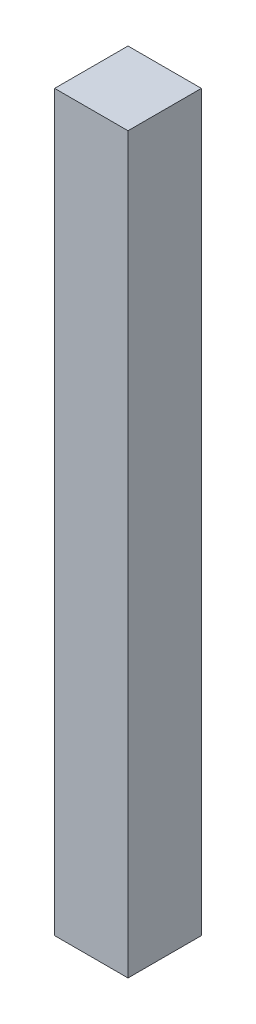
ISO-10303-21;
HEADER;
FILE_DESCRIPTION(('STEP AP214'),'2;1');
FILE_NAME('part.step','',(''),(''),'','','');
FILE_SCHEMA(('AUTOMOTIVE_DESIGN { 1 0 10303 214 1 1 1 1 }'));
ENDSEC;
DATA;
#1=APPLICATION_CONTEXT('core data for automotive mechanical design processes');
#2=APPLICATION_PROTOCOL_DEFINITION('international standard','automotive_design',2000,#1);
#3=PRODUCT_CONTEXT('',#1,'mechanical');
#4=PRODUCT('Part','Part','',(#3));
#5=PRODUCT_RELATED_PRODUCT_CATEGORY('part','',(#4));
#6=PRODUCT_DEFINITION_FORMATION('','',#4);
#7=PRODUCT_DEFINITION_CONTEXT('part definition',#1,'design');
#8=PRODUCT_DEFINITION('design','',#6,#7);
#9=PRODUCT_DEFINITION_SHAPE('','',#8);
#10=(LENGTH_UNIT() NAMED_UNIT(*) SI_UNIT(.MILLI.,.METRE.));
#11=(NAMED_UNIT(*) PLANE_ANGLE_UNIT() SI_UNIT($,.RADIAN.));
#12=(NAMED_UNIT(*) SI_UNIT($,.STERADIAN.) SOLID_ANGLE_UNIT());
#13=UNCERTAINTY_MEASURE_WITH_UNIT(LENGTH_MEASURE(1.E-05),#10,'distance_accuracy_value','');
#14=(GEOMETRIC_REPRESENTATION_CONTEXT(3) GLOBAL_UNCERTAINTY_ASSIGNED_CONTEXT((#13)) GLOBAL_UNIT_ASSIGNED_CONTEXT((#10,
#11,#12)) REPRESENTATION_CONTEXT('',''));
#15=CARTESIAN_POINT('',(0.,0.,0.));
#16=DIRECTION('',(0.,0.,1.));
#17=DIRECTION('',(1.,0.,0.));
#18=AXIS2_PLACEMENT_3D('',#15,#16,#17);
#19=CARTESIAN_POINT('',(0.,0.,5.));
#20=DIRECTION('',(-1.,0.,0.));
#21=DIRECTION('',(0.,-1.,0.));
#22=AXIS2_PLACEMENT_3D('',#19,#20,#21);
#23=PLANE('',#22);
#24=DIRECTION('',(0.,1.,0.));
#25=VECTOR('',#24,1.);
#26=CARTESIAN_POINT('',(0.,0.,0.));
#27=LINE('',#26,#25);
#28=CARTESIAN_POINT('',(0.,-50.,0.));
#29=VERTEX_POINT('',#28);
#30=CARTESIAN_POINT('',(0.,0.,0.));
#31=VERTEX_POINT('',#30);
#32=EDGE_CURVE('E96',#29,#31,#27,.T.);
#33=ORIENTED_EDGE('',*,*,#32,.T.);
#34=DIRECTION('',(0.,0.,-1.));
#35=VECTOR('',#34,1.);
#36=CARTESIAN_POINT('',(0.,0.,5.));
#37=LINE('',#36,#35);
#38=CARTESIAN_POINT('',(0.,0.,5.));
#39=VERTEX_POINT('',#38);
#40=EDGE_CURVE('E11',#39,#31,#37,.T.);
#41=ORIENTED_EDGE('',*,*,#40,.F.);
#42=DIRECTION('',(0.,1.,0.));
#43=VECTOR('',#42,1.);
#44=CARTESIAN_POINT('',(0.,0.,5.));
#45=LINE('',#44,#43);
#46=CARTESIAN_POINT('',(0.,-50.,5.));
#47=VERTEX_POINT('',#46);
#48=EDGE_CURVE('E84',#47,#39,#45,.T.);
#49=ORIENTED_EDGE('',*,*,#48,.F.);
#50=DIRECTION('',(0.,0.,-1.));
#51=VECTOR('',#50,1.);
#52=CARTESIAN_POINT('',(0.,-50.,5.));
#53=LINE('',#52,#51);
#54=EDGE_CURVE('E92',#47,#29,#53,.T.);
#55=ORIENTED_EDGE('',*,*,#54,.T.);
#56=EDGE_LOOP('',(#33,#41,#49,#55));
#57=FACE_BOUND('',#56,.T.);
#58=ADVANCED_FACE('F33',(#57),#23,.F.);
#59=CARTESIAN_POINT('',(0.,0.,5.));
#60=DIRECTION('',(0.,-1.,0.));
#61=DIRECTION('',(0.,0.,-1.));
#62=AXIS2_PLACEMENT_3D('',#59,#60,#61);
#63=PLANE('',#62);
#64=DIRECTION('',(-1.,0.,0.));
#65=VECTOR('',#64,1.);
#66=CARTESIAN_POINT('',(0.,0.,0.));
#67=LINE('',#66,#65);
#68=CARTESIAN_POINT('',(-5.,0.,0.));
#69=VERTEX_POINT('',#68);
#70=EDGE_CURVE('E88',#31,#69,#67,.T.);
#71=ORIENTED_EDGE('',*,*,#70,.T.);
#72=DIRECTION('',(0.,0.,-1.));
#73=VECTOR('',#72,1.);
#74=CARTESIAN_POINT('',(-5.,0.,5.));
#75=LINE('',#74,#73);
#76=CARTESIAN_POINT('',(-5.,0.,5.));
#77=VERTEX_POINT('',#76);
#78=EDGE_CURVE('E41',#77,#69,#75,.T.);
#79=ORIENTED_EDGE('',*,*,#78,.F.);
#80=DIRECTION('',(-1.,0.,0.));
#81=VECTOR('',#80,1.);
#82=CARTESIAN_POINT('',(0.,0.,5.));
#83=LINE('',#82,#81);
#84=EDGE_CURVE('E79',#39,#77,#83,.T.);
#85=ORIENTED_EDGE('',*,*,#84,.F.);
#86=ORIENTED_EDGE('',*,*,#40,.T.);
#87=EDGE_LOOP('',(#71,#79,#85,#86));
#88=FACE_BOUND('',#87,.T.);
#89=ADVANCED_FACE('F87',(#88),#63,.F.);
#90=CARTESIAN_POINT('',(-5.,0.,5.));
#91=DIRECTION('',(1.,0.,0.));
#92=DIRECTION('',(0.,1.,0.));
#93=AXIS2_PLACEMENT_3D('',#90,#91,#92);
#94=PLANE('',#93);
#95=DIRECTION('',(0.,-1.,0.));
#96=VECTOR('',#95,1.);
#97=CARTESIAN_POINT('',(-5.,0.,0.));
#98=LINE('',#97,#96);
#99=CARTESIAN_POINT('',(-4.99999999999999,-50.,0.));
#100=VERTEX_POINT('',#99);
#101=EDGE_CURVE('E66',#69,#100,#98,.T.);
#102=ORIENTED_EDGE('',*,*,#101,.T.);
#103=DIRECTION('',(0.,0.,-1.));
#104=VECTOR('',#103,1.);
#105=CARTESIAN_POINT('',(-4.99999999999999,-50.,5.));
#106=LINE('',#105,#104);
#107=CARTESIAN_POINT('',(-4.99999999999999,-50.,5.));
#108=VERTEX_POINT('',#107);
#109=EDGE_CURVE('E89',#108,#100,#106,.T.);
#110=ORIENTED_EDGE('',*,*,#109,.F.);
#111=DIRECTION('',(0.,-1.,0.));
#112=VECTOR('',#111,1.);
#113=CARTESIAN_POINT('',(-5.,0.,5.));
#114=LINE('',#113,#112);
#115=EDGE_CURVE('E82',#77,#108,#114,.T.);
#116=ORIENTED_EDGE('',*,*,#115,.F.);
#117=ORIENTED_EDGE('',*,*,#78,.T.);
#118=EDGE_LOOP('',(#102,#110,#116,#117));
#119=FACE_BOUND('',#118,.T.);
#120=ADVANCED_FACE('F90',(#119),#94,.F.);
#121=CARTESIAN_POINT('',(0.,-50.,5.));
#122=DIRECTION('',(0.,1.,0.));
#123=DIRECTION('',(0.,0.,1.));
#124=AXIS2_PLACEMENT_3D('',#121,#122,#123);
#125=PLANE('',#124);
#126=DIRECTION('',(1.,0.,0.));
#127=VECTOR('',#126,1.);
#128=CARTESIAN_POINT('',(0.,-50.,0.));
#129=LINE('',#128,#127);
#130=EDGE_CURVE('E72',#100,#29,#129,.T.);
#131=ORIENTED_EDGE('',*,*,#130,.T.);
#132=ORIENTED_EDGE('',*,*,#54,.F.);
#133=DIRECTION('',(1.,0.,0.));
#134=VECTOR('',#133,1.);
#135=CARTESIAN_POINT('',(0.,-50.,5.));
#136=LINE('',#135,#134);
#137=EDGE_CURVE('E49',#108,#47,#136,.T.);
#138=ORIENTED_EDGE('',*,*,#137,.F.);
#139=ORIENTED_EDGE('',*,*,#109,.T.);
#140=EDGE_LOOP('',(#131,#132,#138,#139));
#141=FACE_BOUND('',#140,.T.);
#142=ADVANCED_FACE('F103',(#141),#125,.F.);
#143=CARTESIAN_POINT('',(0.,0.,5.));
#144=DIRECTION('',(0.,0.,-1.));
#145=DIRECTION('',(-1.,0.,0.));
#146=AXIS2_PLACEMENT_3D('',#143,#144,#145);
#147=PLANE('',#146);
#148=ORIENTED_EDGE('',*,*,#48,.T.);
#149=ORIENTED_EDGE('',*,*,#84,.T.);
#150=ORIENTED_EDGE('',*,*,#115,.T.);
#151=ORIENTED_EDGE('',*,*,#137,.T.);
#152=EDGE_LOOP('',(#148,#149,#150,#151));
#153=FACE_BOUND('',#152,.T.);
#154=ADVANCED_FACE('F80',(#153),#147,.F.);
#155=CARTESIAN_POINT('',(0.,0.,0.));
#156=DIRECTION('',(0.,0.,-1.));
#157=DIRECTION('',(-1.,0.,0.));
#158=AXIS2_PLACEMENT_3D('',#155,#156,#157);
#159=PLANE('',#158);
#160=ORIENTED_EDGE('',*,*,#32,.F.);
#161=ORIENTED_EDGE('',*,*,#130,.F.);
#162=ORIENTED_EDGE('',*,*,#101,.F.);
#163=ORIENTED_EDGE('',*,*,#70,.F.);
#164=EDGE_LOOP('',(#160,#161,#162,#163));
#165=FACE_BOUND('',#164,.T.);
#166=ADVANCED_FACE('F106',(#165),#159,.T.);
#167=CLOSED_SHELL('',(#58,#89,#120,#142,#154,#166));
#168=MANIFOLD_SOLID_BREP('B2',#167);
#169=ADVANCED_BREP_SHAPE_REPRESENTATION('',(#18,#168),#14);
#170=SHAPE_DEFINITION_REPRESENTATION(#9,#169);
ENDSEC;
END-ISO-10303-21;
